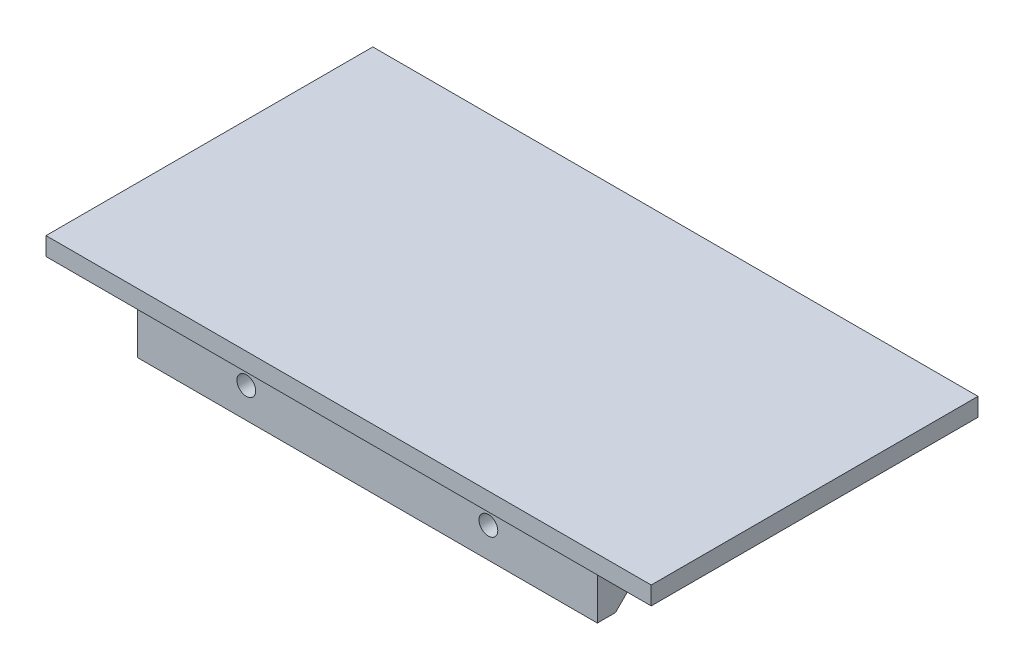
ISO-10303-21;
HEADER;
FILE_DESCRIPTION(('STEP AP214'),'2;1');
FILE_NAME('part.step','',(''),(''),'','','');
FILE_SCHEMA(('AUTOMOTIVE_DESIGN { 1 0 10303 214 1 1 1 1 }'));
ENDSEC;
DATA;
#1=APPLICATION_CONTEXT('core data for automotive mechanical design processes');
#2=APPLICATION_PROTOCOL_DEFINITION('international standard','automotive_design',2000,#1);
#3=PRODUCT_CONTEXT('',#1,'mechanical');
#4=PRODUCT('Part','Part','',(#3));
#5=PRODUCT_RELATED_PRODUCT_CATEGORY('part','',(#4));
#6=PRODUCT_DEFINITION_FORMATION('','',#4);
#7=PRODUCT_DEFINITION_CONTEXT('part definition',#1,'design');
#8=PRODUCT_DEFINITION('design','',#6,#7);
#9=PRODUCT_DEFINITION_SHAPE('','',#8);
#10=(LENGTH_UNIT() NAMED_UNIT(*) SI_UNIT(.MILLI.,.METRE.));
#11=(NAMED_UNIT(*) PLANE_ANGLE_UNIT() SI_UNIT($,.RADIAN.));
#12=(NAMED_UNIT(*) SI_UNIT($,.STERADIAN.) SOLID_ANGLE_UNIT());
#13=UNCERTAINTY_MEASURE_WITH_UNIT(LENGTH_MEASURE(1.E-05),#10,'distance_accuracy_value','');
#14=(GEOMETRIC_REPRESENTATION_CONTEXT(3) GLOBAL_UNCERTAINTY_ASSIGNED_CONTEXT((#13)) GLOBAL_UNIT_ASSIGNED_CONTEXT((#10,
#11,#12)) REPRESENTATION_CONTEXT('',''));
#15=CARTESIAN_POINT('',(0.,0.,0.));
#16=DIRECTION('',(0.,0.,1.));
#17=DIRECTION('',(1.,0.,0.));
#18=AXIS2_PLACEMENT_3D('',#15,#16,#17);
#19=CARTESIAN_POINT('',(-38.,-10.,20.9));
#20=DIRECTION('',(0.,-0.707106781186546,-0.707106781186549));
#21=DIRECTION('',(-1.,0.,0.));
#22=AXIS2_PLACEMENT_3D('',#19,#20,#21);
#23=PLANE('',#22);
#24=DIRECTION('',(-1.,0.,0.));
#25=VECTOR('',#24,1.);
#26=CARTESIAN_POINT('',(-38.,0.,10.9));
#27=LINE('',#26,#25);
#28=CARTESIAN_POINT('',(-25.,0.,10.9));
#29=VERTEX_POINT('',#28);
#30=CARTESIAN_POINT('',(-38.,0.,10.9));
#31=VERTEX_POINT('',#30);
#32=EDGE_CURVE('E179',#29,#31,#27,.T.);
#33=ORIENTED_EDGE('',*,*,#32,.F.);
#34=DIRECTION('',(0.,0.707106781186549,-0.707106781186546));
#35=VECTOR('',#34,1.);
#36=CARTESIAN_POINT('',(-25.,-10.,20.9));
#37=LINE('',#36,#35);
#38=CARTESIAN_POINT('',(-25.,-10.,20.9));
#39=VERTEX_POINT('',#38);
#40=EDGE_CURVE('E11',#29,#39,#37,.F.);
#41=ORIENTED_EDGE('',*,*,#40,.T.);
#42=DIRECTION('',(1.,0.,0.));
#43=VECTOR('',#42,1.);
#44=CARTESIAN_POINT('',(-38.,-10.,20.9));
#45=LINE('',#44,#43);
#46=CARTESIAN_POINT('',(-38.,-10.,20.9));
#47=VERTEX_POINT('',#46);
#48=EDGE_CURVE('E313',#47,#39,#45,.T.);
#49=ORIENTED_EDGE('',*,*,#48,.F.);
#50=DIRECTION('',(0.,0.707106781186549,-0.707106781186546));
#51=VECTOR('',#50,1.);
#52=CARTESIAN_POINT('',(-38.,-11.5,22.4));
#53=LINE('',#52,#51);
#54=EDGE_CURVE('E188',#31,#47,#53,.F.);
#55=ORIENTED_EDGE('',*,*,#54,.F.);
#56=EDGE_LOOP('',(#33,#41,#49,#55));
#57=FACE_BOUND('',#56,.T.);
#58=ADVANCED_FACE('F40',(#57),#23,.T.);
#59=CARTESIAN_POINT('',(25.,-10.,20.9));
#60=VERTEX_POINT('',#59);
#61=CARTESIAN_POINT('',(38.,-10.,20.9));
#62=VERTEX_POINT('',#61);
#63=EDGE_CURVE('E312',#60,#62,#45,.T.);
#64=ORIENTED_EDGE('',*,*,#63,.F.);
#65=DIRECTION('',(0.,-0.707106781186549,0.707106781186546));
#66=VECTOR('',#65,1.);
#67=CARTESIAN_POINT('',(25.,-9.99999999999998,20.9));
#68=LINE('',#67,#66);
#69=CARTESIAN_POINT('',(25.,0.,10.9));
#70=VERTEX_POINT('',#69);
#71=EDGE_CURVE('E228',#60,#70,#68,.F.);
#72=ORIENTED_EDGE('',*,*,#71,.T.);
#73=CARTESIAN_POINT('',(38.,0.,10.9));
#74=VERTEX_POINT('',#73);
#75=EDGE_CURVE('E193',#74,#70,#27,.T.);
#76=ORIENTED_EDGE('',*,*,#75,.F.);
#77=DIRECTION('',(0.,-0.707106781186549,0.707106781186546));
#78=VECTOR('',#77,1.);
#79=CARTESIAN_POINT('',(38.,-10.,20.9));
#80=LINE('',#79,#78);
#81=EDGE_CURVE('E218',#62,#74,#80,.F.);
#82=ORIENTED_EDGE('',*,*,#81,.F.);
#83=EDGE_LOOP('',(#64,#72,#76,#82));
#84=FACE_BOUND('',#83,.T.);
#85=ADVANCED_FACE('F401',(#84),#23,.T.);
#86=CARTESIAN_POINT('',(0.,0.,0.));
#87=DIRECTION('',(0.,1.,0.));
#88=DIRECTION('',(0.,0.,1.));
#89=AXIS2_PLACEMENT_3D('',#86,#87,#88);
#90=PLANE('',#89);
#91=DIRECTION('',(0.,0.,1.));
#92=VECTOR('',#91,1.);
#93=CARTESIAN_POINT('',(38.,0.,20.9));
#94=LINE('',#93,#92);
#95=CARTESIAN_POINT('',(38.,0.,23.9));
#96=VERTEX_POINT('',#95);
#97=EDGE_CURVE('E308',#74,#96,#94,.T.);
#98=ORIENTED_EDGE('',*,*,#97,.F.);
#99=ORIENTED_EDGE('',*,*,#75,.T.);
#100=DIRECTION('',(0.,0.,1.));
#101=VECTOR('',#100,1.);
#102=CARTESIAN_POINT('',(25.,0.,20.9));
#103=LINE('',#102,#101);
#104=CARTESIAN_POINT('',(25.,0.,20.9));
#105=VERTEX_POINT('',#104);
#106=EDGE_CURVE('E253',#70,#105,#103,.T.);
#107=ORIENTED_EDGE('',*,*,#106,.T.);
#108=DIRECTION('',(-1.,0.,0.));
#109=VECTOR('',#108,1.);
#110=CARTESIAN_POINT('',(15.,0.,20.9));
#111=LINE('',#110,#109);
#112=CARTESIAN_POINT('',(15.,0.,20.9));
#113=VERTEX_POINT('',#112);
#114=EDGE_CURVE('E261',#105,#113,#111,.T.);
#115=ORIENTED_EDGE('',*,*,#114,.T.);
#116=DIRECTION('',(0.,0.,-1.));
#117=VECTOR('',#116,1.);
#118=CARTESIAN_POINT('',(15.,0.,10.9));
#119=LINE('',#118,#117);
#120=CARTESIAN_POINT('',(15.,0.,10.9));
#121=VERTEX_POINT('',#120);
#122=EDGE_CURVE('E65',#113,#121,#119,.T.);
#123=ORIENTED_EDGE('',*,*,#122,.T.);
#124=CARTESIAN_POINT('',(-15.,0.,10.9));
#125=VERTEX_POINT('',#124);
#126=EDGE_CURVE('E190',#121,#125,#27,.T.);
#127=ORIENTED_EDGE('',*,*,#126,.T.);
#128=DIRECTION('',(0.,0.,1.));
#129=VECTOR('',#128,1.);
#130=CARTESIAN_POINT('',(-15.,0.,10.9));
#131=LINE('',#130,#129);
#132=CARTESIAN_POINT('',(-15.,0.,20.9));
#133=VERTEX_POINT('',#132);
#134=EDGE_CURVE('E184',#125,#133,#131,.T.);
#135=ORIENTED_EDGE('',*,*,#134,.T.);
#136=DIRECTION('',(-1.,0.,0.));
#137=VECTOR('',#136,1.);
#138=CARTESIAN_POINT('',(-15.,0.,20.9));
#139=LINE('',#138,#137);
#140=CARTESIAN_POINT('',(-25.,0.,20.9));
#141=VERTEX_POINT('',#140);
#142=EDGE_CURVE('E182',#133,#141,#139,.T.);
#143=ORIENTED_EDGE('',*,*,#142,.T.);
#144=DIRECTION('',(0.,0.,-1.));
#145=VECTOR('',#144,1.);
#146=CARTESIAN_POINT('',(-25.,0.,20.9));
#147=LINE('',#146,#145);
#148=EDGE_CURVE('E169',#141,#29,#147,.T.);
#149=ORIENTED_EDGE('',*,*,#148,.T.);
#150=ORIENTED_EDGE('',*,*,#32,.T.);
#151=DIRECTION('',(0.,0.,-1.));
#152=VECTOR('',#151,1.);
#153=CARTESIAN_POINT('',(-38.,0.,23.9));
#154=LINE('',#153,#152);
#155=CARTESIAN_POINT('',(-38.,0.,23.9));
#156=VERTEX_POINT('',#155);
#157=EDGE_CURVE('E323',#156,#31,#154,.T.);
#158=ORIENTED_EDGE('',*,*,#157,.F.);
#159=DIRECTION('',(-1.,0.,0.));
#160=VECTOR('',#159,1.);
#161=CARTESIAN_POINT('',(38.,0.,23.9));
#162=LINE('',#161,#160);
#163=EDGE_CURVE('E302',#96,#156,#162,.T.);
#164=ORIENTED_EDGE('',*,*,#163,.F.);
#165=EDGE_LOOP('',(#98,#99,#107,#115,#123,#127,#135,#143,#149,#150,#158,#164));
#166=FACE_BOUND('',#165,.T.);
#167=DIRECTION('',(0.,0.,1.));
#168=VECTOR('',#167,1.);
#169=CARTESIAN_POINT('',(-50.,0.,27.));
#170=LINE('',#169,#168);
#171=CARTESIAN_POINT('',(-50.,0.,-27.));
#172=VERTEX_POINT('',#171);
#173=CARTESIAN_POINT('',(-50.,0.,27.));
#174=VERTEX_POINT('',#173);
#175=EDGE_CURVE('E336',#172,#174,#170,.T.);
#176=ORIENTED_EDGE('',*,*,#175,.F.);
#177=DIRECTION('',(-1.,0.,0.));
#178=VECTOR('',#177,1.);
#179=CARTESIAN_POINT('',(50.,0.,-27.));
#180=LINE('',#179,#178);
#181=CARTESIAN_POINT('',(50.,0.,-27.));
#182=VERTEX_POINT('',#181);
#183=EDGE_CURVE('E342',#182,#172,#180,.T.);
#184=ORIENTED_EDGE('',*,*,#183,.F.);
#185=DIRECTION('',(0.,0.,-1.));
#186=VECTOR('',#185,1.);
#187=CARTESIAN_POINT('',(50.,0.,27.));
#188=LINE('',#187,#186);
#189=CARTESIAN_POINT('',(50.,0.,27.));
#190=VERTEX_POINT('',#189);
#191=EDGE_CURVE('E358',#190,#182,#188,.T.);
#192=ORIENTED_EDGE('',*,*,#191,.F.);
#193=DIRECTION('',(1.,0.,0.));
#194=VECTOR('',#193,1.);
#195=CARTESIAN_POINT('',(50.,0.,27.));
#196=LINE('',#195,#194);
#197=EDGE_CURVE('E355',#174,#190,#196,.T.);
#198=ORIENTED_EDGE('',*,*,#197,.F.);
#199=EDGE_LOOP('',(#176,#184,#192,#198));
#200=FACE_BOUND('',#199,.T.);
#201=DIRECTION('',(0.,0.,-1.));
#202=VECTOR('',#201,1.);
#203=CARTESIAN_POINT('',(-38.,0.,-20.9));
#204=LINE('',#203,#202);
#205=CARTESIAN_POINT('',(-38.,0.,-10.9000000000001));
#206=VERTEX_POINT('',#205);
#207=CARTESIAN_POINT('',(-38.,0.,-23.9));
#208=VERTEX_POINT('',#207);
#209=EDGE_CURVE('E248',#206,#208,#204,.T.);
#210=ORIENTED_EDGE('',*,*,#209,.F.);
#211=DIRECTION('',(1.,0.,0.));
#212=VECTOR('',#211,1.);
#213=CARTESIAN_POINT('',(38.,0.,-10.9));
#214=LINE('',#213,#212);
#215=CARTESIAN_POINT('',(38.,0.,-10.9));
#216=VERTEX_POINT('',#215);
#217=EDGE_CURVE('E202',#206,#216,#214,.T.);
#218=ORIENTED_EDGE('',*,*,#217,.T.);
#219=DIRECTION('',(0.,0.,1.));
#220=VECTOR('',#219,1.);
#221=CARTESIAN_POINT('',(38.,0.,-23.9));
#222=LINE('',#221,#220);
#223=CARTESIAN_POINT('',(38.,0.,-23.9));
#224=VERTEX_POINT('',#223);
#225=EDGE_CURVE('E274',#224,#216,#222,.T.);
#226=ORIENTED_EDGE('',*,*,#225,.F.);
#227=DIRECTION('',(1.,0.,0.));
#228=VECTOR('',#227,1.);
#229=CARTESIAN_POINT('',(-38.,0.,-23.9));
#230=LINE('',#229,#228);
#231=EDGE_CURVE('E289',#208,#224,#230,.T.);
#232=ORIENTED_EDGE('',*,*,#231,.F.);
#233=EDGE_LOOP('',(#210,#218,#226,#232));
#234=FACE_BOUND('',#233,.T.);
#235=ADVANCED_FACE('F177',(#166,#200,#234),#90,.F.);
#236=CARTESIAN_POINT('',(-50.,3.,27.));
#237=DIRECTION('',(1.,0.,0.));
#238=DIRECTION('',(0.,0.,-1.));
#239=AXIS2_PLACEMENT_3D('',#236,#237,#238);
#240=PLANE('',#239);
#241=ORIENTED_EDGE('',*,*,#175,.T.);
#242=DIRECTION('',(0.,-1.,0.));
#243=VECTOR('',#242,1.);
#244=CARTESIAN_POINT('',(-50.,3.,27.));
#245=LINE('',#244,#243);
#246=CARTESIAN_POINT('',(-50.,3.,27.));
#247=VERTEX_POINT('',#246);
#248=EDGE_CURVE('E191',#247,#174,#245,.T.);
#249=ORIENTED_EDGE('',*,*,#248,.F.);
#250=DIRECTION('',(0.,0.,1.));
#251=VECTOR('',#250,1.);
#252=CARTESIAN_POINT('',(-50.,3.,27.));
#253=LINE('',#252,#251);
#254=CARTESIAN_POINT('',(-50.,3.,-27.));
#255=VERTEX_POINT('',#254);
#256=EDGE_CURVE('E337',#255,#247,#253,.T.);
#257=ORIENTED_EDGE('',*,*,#256,.F.);
#258=DIRECTION('',(0.,-1.,0.));
#259=VECTOR('',#258,1.);
#260=CARTESIAN_POINT('',(-50.,3.,-27.));
#261=LINE('',#260,#259);
#262=EDGE_CURVE('E351',#255,#172,#261,.T.);
#263=ORIENTED_EDGE('',*,*,#262,.T.);
#264=EDGE_LOOP('',(#241,#249,#257,#263));
#265=FACE_BOUND('',#264,.T.);
#266=ADVANCED_FACE('F387',(#265),#240,.F.);
#267=CARTESIAN_POINT('',(50.,3.,27.));
#268=DIRECTION('',(0.,0.,-1.));
#269=DIRECTION('',(-1.,0.,0.));
#270=AXIS2_PLACEMENT_3D('',#267,#268,#269);
#271=PLANE('',#270);
#272=ORIENTED_EDGE('',*,*,#197,.T.);
#273=DIRECTION('',(0.,-1.,0.));
#274=VECTOR('',#273,1.);
#275=CARTESIAN_POINT('',(50.,3.,27.));
#276=LINE('',#275,#274);
#277=CARTESIAN_POINT('',(50.,3.,27.));
#278=VERTEX_POINT('',#277);
#279=EDGE_CURVE('E197',#278,#190,#276,.T.);
#280=ORIENTED_EDGE('',*,*,#279,.F.);
#281=DIRECTION('',(1.,0.,0.));
#282=VECTOR('',#281,1.);
#283=CARTESIAN_POINT('',(50.,3.,27.));
#284=LINE('',#283,#282);
#285=EDGE_CURVE('E341',#247,#278,#284,.T.);
#286=ORIENTED_EDGE('',*,*,#285,.F.);
#287=ORIENTED_EDGE('',*,*,#248,.T.);
#288=EDGE_LOOP('',(#272,#280,#286,#287));
#289=FACE_BOUND('',#288,.T.);
#290=ADVANCED_FACE('F391',(#289),#271,.F.);
#291=CARTESIAN_POINT('',(50.,3.,27.));
#292=DIRECTION('',(-1.,0.,0.));
#293=DIRECTION('',(0.,0.,1.));
#294=AXIS2_PLACEMENT_3D('',#291,#292,#293);
#295=PLANE('',#294);
#296=ORIENTED_EDGE('',*,*,#191,.T.);
#297=DIRECTION('',(0.,-1.,0.));
#298=VECTOR('',#297,1.);
#299=CARTESIAN_POINT('',(50.,3.,-27.));
#300=LINE('',#299,#298);
#301=CARTESIAN_POINT('',(50.,3.,-27.));
#302=VERTEX_POINT('',#301);
#303=EDGE_CURVE('E366',#302,#182,#300,.T.);
#304=ORIENTED_EDGE('',*,*,#303,.F.);
#305=DIRECTION('',(0.,0.,-1.));
#306=VECTOR('',#305,1.);
#307=CARTESIAN_POINT('',(50.,3.,27.));
#308=LINE('',#307,#306);
#309=EDGE_CURVE('E345',#278,#302,#308,.T.);
#310=ORIENTED_EDGE('',*,*,#309,.F.);
#311=ORIENTED_EDGE('',*,*,#279,.T.);
#312=EDGE_LOOP('',(#296,#304,#310,#311));
#313=FACE_BOUND('',#312,.T.);
#314=ADVANCED_FACE('F376',(#313),#295,.F.);
#315=CARTESIAN_POINT('',(50.,3.,-27.));
#316=DIRECTION('',(0.,0.,1.));
#317=DIRECTION('',(1.,0.,0.));
#318=AXIS2_PLACEMENT_3D('',#315,#316,#317);
#319=PLANE('',#318);
#320=ORIENTED_EDGE('',*,*,#183,.T.);
#321=ORIENTED_EDGE('',*,*,#262,.F.);
#322=DIRECTION('',(-1.,0.,0.));
#323=VECTOR('',#322,1.);
#324=CARTESIAN_POINT('',(50.,3.,-27.));
#325=LINE('',#324,#323);
#326=EDGE_CURVE('E348',#302,#255,#325,.T.);
#327=ORIENTED_EDGE('',*,*,#326,.F.);
#328=ORIENTED_EDGE('',*,*,#303,.T.);
#329=EDGE_LOOP('',(#320,#321,#327,#328));
#330=FACE_BOUND('',#329,.T.);
#331=ADVANCED_FACE('F383',(#330),#319,.F.);
#332=CARTESIAN_POINT('',(0.,3.,0.));
#333=DIRECTION('',(0.,1.,0.));
#334=DIRECTION('',(0.,0.,1.));
#335=AXIS2_PLACEMENT_3D('',#332,#333,#334);
#336=PLANE('',#335);
#337=ORIENTED_EDGE('',*,*,#256,.T.);
#338=ORIENTED_EDGE('',*,*,#285,.T.);
#339=ORIENTED_EDGE('',*,*,#309,.T.);
#340=ORIENTED_EDGE('',*,*,#326,.T.);
#341=EDGE_LOOP('',(#337,#338,#339,#340));
#342=FACE_BOUND('',#341,.T.);
#343=ADVANCED_FACE('F390',(#342),#336,.T.);
#344=CARTESIAN_POINT('',(38.,-10.,23.9));
#345=DIRECTION('',(0.,0.,-1.));
#346=DIRECTION('',(-1.,0.,0.));
#347=AXIS2_PLACEMENT_3D('',#344,#345,#346);
#348=PLANE('',#347);
#349=CARTESIAN_POINT('',(-20.,-4.99999999999999,23.9));
#350=DIRECTION('',(0.,0.,1.));
#351=DIRECTION('',(1.,0.,0.));
#352=AXIS2_PLACEMENT_3D('',#349,#350,#351);
#353=CIRCLE('',#352,1.55);
#354=CARTESIAN_POINT('',(-18.45,-4.99999999999999,23.9));
#355=VERTEX_POINT('',#354);
#356=EDGE_CURVE('E581',#355,#355,#353,.T.);
#357=ORIENTED_EDGE('',*,*,#356,.F.);
#358=EDGE_LOOP('',(#357));
#359=FACE_BOUND('',#358,.T.);
#360=CARTESIAN_POINT('',(20.,-4.99999999999999,23.9));
#361=DIRECTION('',(0.,0.,1.));
#362=DIRECTION('',(1.,0.,0.));
#363=AXIS2_PLACEMENT_3D('',#360,#361,#362);
#364=CIRCLE('',#363,1.55);
#365=CARTESIAN_POINT('',(21.55,-4.99999999999999,23.9));
#366=VERTEX_POINT('',#365);
#367=EDGE_CURVE('E589',#366,#366,#364,.T.);
#368=ORIENTED_EDGE('',*,*,#367,.F.);
#369=EDGE_LOOP('',(#368));
#370=FACE_BOUND('',#369,.T.);
#371=ORIENTED_EDGE('',*,*,#163,.T.);
#372=DIRECTION('',(0.,1.,0.));
#373=VECTOR('',#372,1.);
#374=CARTESIAN_POINT('',(-38.,-10.,23.9));
#375=LINE('',#374,#373);
#376=CARTESIAN_POINT('',(-38.,-10.,23.9));
#377=VERTEX_POINT('',#376);
#378=EDGE_CURVE('E332',#377,#156,#375,.T.);
#379=ORIENTED_EDGE('',*,*,#378,.F.);
#380=DIRECTION('',(-1.,0.,0.));
#381=VECTOR('',#380,1.);
#382=CARTESIAN_POINT('',(38.,-10.,23.9));
#383=LINE('',#382,#381);
#384=CARTESIAN_POINT('',(38.,-10.,23.9));
#385=VERTEX_POINT('',#384);
#386=EDGE_CURVE('E303',#385,#377,#383,.T.);
#387=ORIENTED_EDGE('',*,*,#386,.F.);
#388=DIRECTION('',(0.,1.,0.));
#389=VECTOR('',#388,1.);
#390=CARTESIAN_POINT('',(38.,-10.,23.9));
#391=LINE('',#390,#389);
#392=EDGE_CURVE('E319',#385,#96,#391,.T.);
#393=ORIENTED_EDGE('',*,*,#392,.T.);
#394=EDGE_LOOP('',(#371,#379,#387,#393));
#395=FACE_BOUND('',#394,.T.);
#396=ADVANCED_FACE('F460',(#359,#370,#395),#348,.F.);
#397=CARTESIAN_POINT('',(-38.,-10.,23.9));
#398=DIRECTION('',(1.,0.,0.));
#399=DIRECTION('',(0.,0.,-1.));
#400=AXIS2_PLACEMENT_3D('',#397,#398,#399);
#401=PLANE('',#400);
#402=ORIENTED_EDGE('',*,*,#157,.T.);
#403=ORIENTED_EDGE('',*,*,#54,.T.);
#404=DIRECTION('',(0.,0.,-1.));
#405=VECTOR('',#404,1.);
#406=CARTESIAN_POINT('',(-38.,-10.,23.9));
#407=LINE('',#406,#405);
#408=EDGE_CURVE('E307',#377,#47,#407,.T.);
#409=ORIENTED_EDGE('',*,*,#408,.F.);
#410=ORIENTED_EDGE('',*,*,#378,.T.);
#411=EDGE_LOOP('',(#402,#403,#409,#410));
#412=FACE_BOUND('',#411,.T.);
#413=ADVANCED_FACE('F456',(#412),#401,.F.);
#414=CARTESIAN_POINT('',(38.,-10.,20.9));
#415=DIRECTION('',(-1.,0.,0.));
#416=DIRECTION('',(0.,0.,1.));
#417=AXIS2_PLACEMENT_3D('',#414,#415,#416);
#418=PLANE('',#417);
#419=ORIENTED_EDGE('',*,*,#97,.T.);
#420=ORIENTED_EDGE('',*,*,#392,.F.);
#421=DIRECTION('',(0.,0.,1.));
#422=VECTOR('',#421,1.);
#423=CARTESIAN_POINT('',(38.,-10.,20.9));
#424=LINE('',#423,#422);
#425=EDGE_CURVE('E316',#62,#385,#424,.T.);
#426=ORIENTED_EDGE('',*,*,#425,.F.);
#427=ORIENTED_EDGE('',*,*,#81,.T.);
#428=EDGE_LOOP('',(#419,#420,#426,#427));
#429=FACE_BOUND('',#428,.T.);
#430=ADVANCED_FACE('F449',(#429),#418,.F.);
#431=CARTESIAN_POINT('',(0.,-10.,0.));
#432=DIRECTION('',(0.,-1.,0.));
#433=DIRECTION('',(0.,0.,-1.));
#434=AXIS2_PLACEMENT_3D('',#431,#432,#433);
#435=PLANE('',#434);
#436=ORIENTED_EDGE('',*,*,#386,.T.);
#437=ORIENTED_EDGE('',*,*,#408,.T.);
#438=ORIENTED_EDGE('',*,*,#48,.T.);
#439=DIRECTION('',(-1.,0.,0.));
#440=VECTOR('',#439,1.);
#441=CARTESIAN_POINT('',(-15.,-10.,20.9));
#442=LINE('',#441,#440);
#443=CARTESIAN_POINT('',(-15.,-10.,20.9));
#444=VERTEX_POINT('',#443);
#445=EDGE_CURVE('E185',#444,#39,#442,.T.);
#446=ORIENTED_EDGE('',*,*,#445,.F.);
#447=CARTESIAN_POINT('',(15.,-10.,20.9));
#448=VERTEX_POINT('',#447);
#449=EDGE_CURVE('E237',#444,#448,#45,.T.);
#450=ORIENTED_EDGE('',*,*,#449,.T.);
#451=DIRECTION('',(-1.,0.,0.));
#452=VECTOR('',#451,1.);
#453=CARTESIAN_POINT('',(15.,-10.,20.9));
#454=LINE('',#453,#452);
#455=EDGE_CURVE('E249',#60,#448,#454,.T.);
#456=ORIENTED_EDGE('',*,*,#455,.F.);
#457=ORIENTED_EDGE('',*,*,#63,.T.);
#458=ORIENTED_EDGE('',*,*,#425,.T.);
#459=EDGE_LOOP('',(#436,#437,#438,#446,#450,#456,#457,#458));
#460=FACE_BOUND('',#459,.T.);
#461=ADVANCED_FACE('F442',(#460),#435,.T.);
#462=CARTESIAN_POINT('',(-38.,-10.,-20.9));
#463=DIRECTION('',(1.,0.,0.));
#464=DIRECTION('',(0.,0.,-1.));
#465=AXIS2_PLACEMENT_3D('',#462,#463,#464);
#466=PLANE('',#465);
#467=ORIENTED_EDGE('',*,*,#209,.T.);
#468=DIRECTION('',(0.,1.,0.));
#469=VECTOR('',#468,1.);
#470=CARTESIAN_POINT('',(-38.,-10.,-23.9));
#471=LINE('',#470,#469);
#472=CARTESIAN_POINT('',(-38.,-10.,-23.9));
#473=VERTEX_POINT('',#472);
#474=EDGE_CURVE('E298',#473,#208,#471,.T.);
#475=ORIENTED_EDGE('',*,*,#474,.F.);
#476=DIRECTION('',(0.,0.,-1.));
#477=VECTOR('',#476,1.);
#478=CARTESIAN_POINT('',(-38.,-10.,-20.9));
#479=LINE('',#478,#477);
#480=CARTESIAN_POINT('',(-38.,-10.,-20.9));
#481=VERTEX_POINT('',#480);
#482=EDGE_CURVE('E269',#481,#473,#479,.T.);
#483=ORIENTED_EDGE('',*,*,#482,.F.);
#484=DIRECTION('',(0.,-0.707106781186549,-0.707106781186546));
#485=VECTOR('',#484,1.);
#486=CARTESIAN_POINT('',(-38.,-10.,-20.9));
#487=LINE('',#486,#485);
#488=EDGE_CURVE('E207',#481,#206,#487,.F.);
#489=ORIENTED_EDGE('',*,*,#488,.T.);
#490=EDGE_LOOP('',(#467,#475,#483,#489));
#491=FACE_BOUND('',#490,.T.);
#492=ADVANCED_FACE('F440',(#491),#466,.F.);
#493=CARTESIAN_POINT('',(-38.,-10.,-23.9));
#494=DIRECTION('',(0.,0.,1.));
#495=DIRECTION('',(1.,0.,0.));
#496=AXIS2_PLACEMENT_3D('',#493,#494,#495);
#497=PLANE('',#496);
#498=ORIENTED_EDGE('',*,*,#231,.T.);
#499=DIRECTION('',(0.,1.,0.));
#500=VECTOR('',#499,1.);
#501=CARTESIAN_POINT('',(38.,-10.,-23.9));
#502=LINE('',#501,#500);
#503=CARTESIAN_POINT('',(38.,-10.,-23.9));
#504=VERTEX_POINT('',#503);
#505=EDGE_CURVE('E285',#504,#224,#502,.T.);
#506=ORIENTED_EDGE('',*,*,#505,.F.);
#507=DIRECTION('',(1.,0.,0.));
#508=VECTOR('',#507,1.);
#509=CARTESIAN_POINT('',(-38.,-10.,-23.9));
#510=LINE('',#509,#508);
#511=EDGE_CURVE('E273',#473,#504,#510,.T.);
#512=ORIENTED_EDGE('',*,*,#511,.F.);
#513=ORIENTED_EDGE('',*,*,#474,.T.);
#514=EDGE_LOOP('',(#498,#506,#512,#513));
#515=FACE_BOUND('',#514,.T.);
#516=ADVANCED_FACE('F438',(#515),#497,.F.);
#517=CARTESIAN_POINT('',(38.,-10.,-23.9));
#518=DIRECTION('',(-1.,0.,0.));
#519=DIRECTION('',(0.,0.,1.));
#520=AXIS2_PLACEMENT_3D('',#517,#518,#519);
#521=PLANE('',#520);
#522=ORIENTED_EDGE('',*,*,#225,.T.);
#523=DIRECTION('',(0.,0.707106781186549,0.707106781186546));
#524=VECTOR('',#523,1.);
#525=CARTESIAN_POINT('',(38.,-11.5,-22.4));
#526=LINE('',#525,#524);
#527=CARTESIAN_POINT('',(38.,-10.,-20.9));
#528=VERTEX_POINT('',#527);
#529=EDGE_CURVE('E213',#216,#528,#526,.F.);
#530=ORIENTED_EDGE('',*,*,#529,.T.);
#531=DIRECTION('',(0.,0.,1.));
#532=VECTOR('',#531,1.);
#533=CARTESIAN_POINT('',(38.,-10.,-23.9));
#534=LINE('',#533,#532);
#535=EDGE_CURVE('E277',#504,#528,#534,.T.);
#536=ORIENTED_EDGE('',*,*,#535,.F.);
#537=ORIENTED_EDGE('',*,*,#505,.T.);
#538=EDGE_LOOP('',(#522,#530,#536,#537));
#539=FACE_BOUND('',#538,.T.);
#540=ADVANCED_FACE('F423',(#539),#521,.F.);
#541=CARTESIAN_POINT('',(0.,-10.,0.));
#542=DIRECTION('',(0.,-1.,0.));
#543=DIRECTION('',(0.,0.,-1.));
#544=AXIS2_PLACEMENT_3D('',#541,#542,#543);
#545=PLANE('',#544);
#546=ORIENTED_EDGE('',*,*,#482,.T.);
#547=ORIENTED_EDGE('',*,*,#511,.T.);
#548=ORIENTED_EDGE('',*,*,#535,.T.);
#549=DIRECTION('',(-1.,0.,0.));
#550=VECTOR('',#549,1.);
#551=CARTESIAN_POINT('',(38.,-10.,-20.9));
#552=LINE('',#551,#550);
#553=EDGE_CURVE('E281',#528,#481,#552,.T.);
#554=ORIENTED_EDGE('',*,*,#553,.T.);
#555=EDGE_LOOP('',(#546,#547,#548,#554));
#556=FACE_BOUND('',#555,.T.);
#557=ADVANCED_FACE('F419',(#556),#545,.T.);
#558=CARTESIAN_POINT('',(38.,-10.,-20.9));
#559=DIRECTION('',(0.,-0.707106781186546,0.707106781186549));
#560=DIRECTION('',(1.,0.,0.));
#561=AXIS2_PLACEMENT_3D('',#558,#559,#560);
#562=PLANE('',#561);
#563=ORIENTED_EDGE('',*,*,#529,.F.);
#564=ORIENTED_EDGE('',*,*,#217,.F.);
#565=ORIENTED_EDGE('',*,*,#488,.F.);
#566=ORIENTED_EDGE('',*,*,#553,.F.);
#567=EDGE_LOOP('',(#563,#564,#565,#566));
#568=FACE_BOUND('',#567,.T.);
#569=ADVANCED_FACE('F409',(#568),#562,.T.);
#570=ORIENTED_EDGE('',*,*,#449,.F.);
#571=DIRECTION('',(0.,-0.707106781186549,0.707106781186546));
#572=VECTOR('',#571,1.);
#573=CARTESIAN_POINT('',(-15.,-10.,20.9));
#574=LINE('',#573,#572);
#575=EDGE_CURVE('E50',#444,#125,#574,.F.);
#576=ORIENTED_EDGE('',*,*,#575,.T.);
#577=ORIENTED_EDGE('',*,*,#126,.F.);
#578=DIRECTION('',(0.,0.707106781186549,-0.707106781186546));
#579=VECTOR('',#578,1.);
#580=CARTESIAN_POINT('',(15.,-10.,20.9));
#581=LINE('',#580,#579);
#582=EDGE_CURVE('E224',#121,#448,#581,.F.);
#583=ORIENTED_EDGE('',*,*,#582,.T.);
#584=EDGE_LOOP('',(#570,#576,#577,#583));
#585=FACE_BOUND('',#584,.T.);
#586=ADVANCED_FACE('F43',(#585),#23,.T.);
#587=CARTESIAN_POINT('',(25.,14.1421356237309,20.9));
#588=DIRECTION('',(1.,0.,0.));
#589=DIRECTION('',(0.,0.,-1.));
#590=AXIS2_PLACEMENT_3D('',#587,#588,#589);
#591=PLANE('',#590);
#592=DIRECTION('',(0.,-1.,0.));
#593=VECTOR('',#592,1.);
#594=CARTESIAN_POINT('',(25.,14.1421356237309,20.9));
#595=LINE('',#594,#593);
#596=EDGE_CURVE('E257',#105,#60,#595,.T.);
#597=ORIENTED_EDGE('',*,*,#596,.F.);
#598=ORIENTED_EDGE('',*,*,#106,.F.);
#599=ORIENTED_EDGE('',*,*,#71,.F.);
#600=EDGE_LOOP('',(#597,#598,#599));
#601=FACE_BOUND('',#600,.T.);
#602=ADVANCED_FACE('F408',(#601),#591,.F.);
#603=CARTESIAN_POINT('',(15.,14.1421356237309,10.9));
#604=DIRECTION('',(-1.,0.,0.));
#605=DIRECTION('',(0.,0.,1.));
#606=AXIS2_PLACEMENT_3D('',#603,#604,#605);
#607=PLANE('',#606);
#608=ORIENTED_EDGE('',*,*,#122,.F.);
#609=DIRECTION('',(0.,-1.,0.));
#610=VECTOR('',#609,1.);
#611=CARTESIAN_POINT('',(15.,14.1421356237309,20.9));
#612=LINE('',#611,#610);
#613=EDGE_CURVE('E260',#113,#448,#612,.T.);
#614=ORIENTED_EDGE('',*,*,#613,.T.);
#615=ORIENTED_EDGE('',*,*,#582,.F.);
#616=EDGE_LOOP('',(#608,#614,#615));
#617=FACE_BOUND('',#616,.T.);
#618=ADVANCED_FACE('F415',(#617),#607,.F.);
#619=CARTESIAN_POINT('',(15.,14.1421356237309,20.9));
#620=DIRECTION('',(0.,0.,1.));
#621=DIRECTION('',(1.,0.,0.));
#622=AXIS2_PLACEMENT_3D('',#619,#620,#621);
#623=PLANE('',#622);
#624=CARTESIAN_POINT('',(20.,-4.99999999999999,20.9));
#625=DIRECTION('',(0.,0.,1.));
#626=DIRECTION('',(1.,0.,0.));
#627=AXIS2_PLACEMENT_3D('',#624,#625,#626);
#628=CIRCLE('',#627,1.55);
#629=CARTESIAN_POINT('',(21.55,-4.99999999999999,20.9));
#630=VERTEX_POINT('',#629);
#631=EDGE_CURVE('E583',#630,#630,#628,.F.);
#632=ORIENTED_EDGE('',*,*,#631,.F.);
#633=EDGE_LOOP('',(#632));
#634=FACE_BOUND('',#633,.T.);
#635=ORIENTED_EDGE('',*,*,#596,.T.);
#636=ORIENTED_EDGE('',*,*,#455,.T.);
#637=ORIENTED_EDGE('',*,*,#613,.F.);
#638=ORIENTED_EDGE('',*,*,#114,.F.);
#639=EDGE_LOOP('',(#635,#636,#637,#638));
#640=FACE_BOUND('',#639,.T.);
#641=ADVANCED_FACE('F551',(#634,#640),#623,.F.);
#642=CARTESIAN_POINT('',(-25.,14.1421356237309,20.9));
#643=DIRECTION('',(-1.,0.,0.));
#644=DIRECTION('',(0.,0.,1.));
#645=AXIS2_PLACEMENT_3D('',#642,#643,#644);
#646=PLANE('',#645);
#647=ORIENTED_EDGE('',*,*,#148,.F.);
#648=DIRECTION('',(0.,-1.,0.));
#649=VECTOR('',#648,1.);
#650=CARTESIAN_POINT('',(-25.,14.1421356237309,20.9));
#651=LINE('',#650,#649);
#652=EDGE_CURVE('E172',#141,#39,#651,.T.);
#653=ORIENTED_EDGE('',*,*,#652,.T.);
#654=ORIENTED_EDGE('',*,*,#40,.F.);
#655=EDGE_LOOP('',(#647,#653,#654));
#656=FACE_BOUND('',#655,.T.);
#657=ADVANCED_FACE('F168',(#656),#646,.F.);
#658=CARTESIAN_POINT('',(-15.,14.1421356237309,10.9));
#659=DIRECTION('',(1.,0.,0.));
#660=DIRECTION('',(0.,0.,-1.));
#661=AXIS2_PLACEMENT_3D('',#658,#659,#660);
#662=PLANE('',#661);
#663=DIRECTION('',(0.,-1.,0.));
#664=VECTOR('',#663,1.);
#665=CARTESIAN_POINT('',(-15.,14.1421356237309,20.9));
#666=LINE('',#665,#664);
#667=EDGE_CURVE('E57',#133,#444,#666,.T.);
#668=ORIENTED_EDGE('',*,*,#667,.F.);
#669=ORIENTED_EDGE('',*,*,#134,.F.);
#670=ORIENTED_EDGE('',*,*,#575,.F.);
#671=EDGE_LOOP('',(#668,#669,#670));
#672=FACE_BOUND('',#671,.T.);
#673=ADVANCED_FACE('F560',(#672),#662,.F.);
#674=CARTESIAN_POINT('',(-15.,14.1421356237309,20.9));
#675=DIRECTION('',(0.,0.,1.));
#676=DIRECTION('',(1.,0.,0.));
#677=AXIS2_PLACEMENT_3D('',#674,#675,#676);
#678=PLANE('',#677);
#679=CARTESIAN_POINT('',(-20.,-4.99999999999999,20.9));
#680=DIRECTION('',(0.,0.,1.));
#681=DIRECTION('',(1.,0.,0.));
#682=AXIS2_PLACEMENT_3D('',#679,#680,#681);
#683=CIRCLE('',#682,1.55);
#684=CARTESIAN_POINT('',(-18.45,-4.99999999999999,20.9));
#685=VERTEX_POINT('',#684);
#686=EDGE_CURVE('E254',#685,#685,#683,.F.);
#687=ORIENTED_EDGE('',*,*,#686,.F.);
#688=EDGE_LOOP('',(#687));
#689=FACE_BOUND('',#688,.T.);
#690=ORIENTED_EDGE('',*,*,#667,.T.);
#691=ORIENTED_EDGE('',*,*,#445,.T.);
#692=ORIENTED_EDGE('',*,*,#652,.F.);
#693=ORIENTED_EDGE('',*,*,#142,.F.);
#694=EDGE_LOOP('',(#690,#691,#692,#693));
#695=FACE_BOUND('',#694,.T.);
#696=ADVANCED_FACE('F563',(#689,#695),#678,.F.);
#697=CARTESIAN_POINT('',(-20.,-4.99999999999999,16.5159379566434));
#698=DIRECTION('',(0.,0.,1.));
#699=DIRECTION('',(1.,0.,0.));
#700=AXIS2_PLACEMENT_3D('',#697,#698,#699);
#701=CYLINDRICAL_SURFACE('',#700,1.55);
#702=ORIENTED_EDGE('',*,*,#686,.T.);
#703=EDGE_LOOP('',(#702));
#704=FACE_BOUND('',#703,.T.);
#705=ORIENTED_EDGE('',*,*,#356,.T.);
#706=EDGE_LOOP('',(#705));
#707=FACE_BOUND('',#706,.T.);
#708=ADVANCED_FACE('F566',(#704,#707),#701,.F.);
#709=CARTESIAN_POINT('',(20.,-4.99999999999999,16.5159379566434));
#710=DIRECTION('',(0.,0.,1.));
#711=DIRECTION('',(1.,0.,0.));
#712=AXIS2_PLACEMENT_3D('',#709,#710,#711);
#713=CYLINDRICAL_SURFACE('',#712,1.55);
#714=ORIENTED_EDGE('',*,*,#631,.T.);
#715=EDGE_LOOP('',(#714));
#716=FACE_BOUND('',#715,.T.);
#717=ORIENTED_EDGE('',*,*,#367,.T.);
#718=EDGE_LOOP('',(#717));
#719=FACE_BOUND('',#718,.T.);
#720=ADVANCED_FACE('F568',(#716,#719),#713,.F.);
#721=CLOSED_SHELL('',(#58,#85,#235,#266,#290,#314,#331,#343,#396,#413,#430,#461,#492,#516,#540,
#557,#569,#586,#602,#618,#641,#657,#673,#696,#708,#720));
#722=MANIFOLD_SOLID_BREP('B2',#721);
#723=ADVANCED_BREP_SHAPE_REPRESENTATION('',(#18,#722),#14);
#724=SHAPE_DEFINITION_REPRESENTATION(#9,#723);
ENDSEC;
END-ISO-10303-21;
